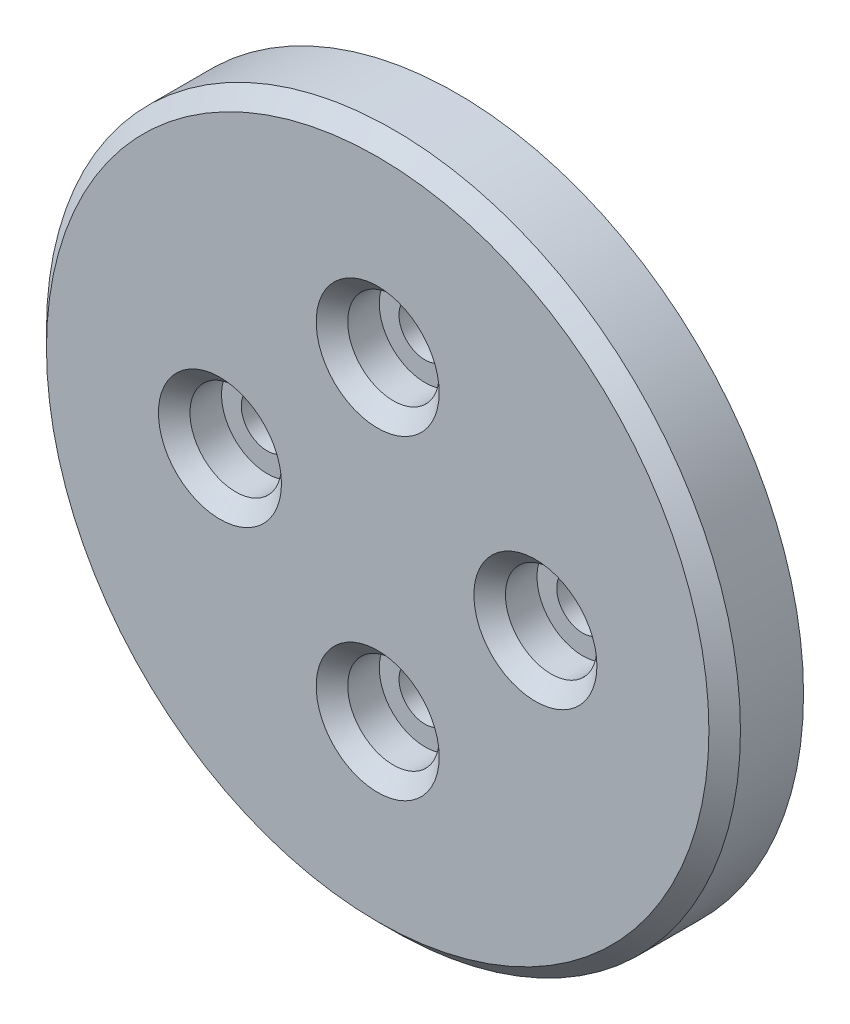
ISO-10303-21;
HEADER;
FILE_DESCRIPTION(('STEP AP214'),'2;1');
FILE_NAME('part.step','',(''),(''),'','','');
FILE_SCHEMA(('AUTOMOTIVE_DESIGN { 1 0 10303 214 1 1 1 1 }'));
ENDSEC;
DATA;
#1=APPLICATION_CONTEXT('core data for automotive mechanical design processes');
#2=APPLICATION_PROTOCOL_DEFINITION('international standard','automotive_design',2000,#1);
#3=PRODUCT_CONTEXT('',#1,'mechanical');
#4=PRODUCT('Part','Part','',(#3));
#5=PRODUCT_RELATED_PRODUCT_CATEGORY('part','',(#4));
#6=PRODUCT_DEFINITION_FORMATION('','',#4);
#7=PRODUCT_DEFINITION_CONTEXT('part definition',#1,'design');
#8=PRODUCT_DEFINITION('design','',#6,#7);
#9=PRODUCT_DEFINITION_SHAPE('','',#8);
#10=(LENGTH_UNIT() NAMED_UNIT(*) SI_UNIT(.MILLI.,.METRE.));
#11=(NAMED_UNIT(*) PLANE_ANGLE_UNIT() SI_UNIT($,.RADIAN.));
#12=(NAMED_UNIT(*) SI_UNIT($,.STERADIAN.) SOLID_ANGLE_UNIT());
#13=UNCERTAINTY_MEASURE_WITH_UNIT(LENGTH_MEASURE(1.E-05),#10,'distance_accuracy_value','');
#14=(GEOMETRIC_REPRESENTATION_CONTEXT(3) GLOBAL_UNCERTAINTY_ASSIGNED_CONTEXT((#13)) GLOBAL_UNIT_ASSIGNED_CONTEXT((#10,
#11,#12)) REPRESENTATION_CONTEXT('',''));
#15=CARTESIAN_POINT('',(0.,0.,0.));
#16=DIRECTION('',(0.,0.,1.));
#17=DIRECTION('',(1.,0.,0.));
#18=AXIS2_PLACEMENT_3D('',#15,#16,#17);
#19=CARTESIAN_POINT('',(10.,0.,5.));
#20=DIRECTION('',(0.,0.,-1.));
#21=DIRECTION('',(-1.,0.,0.));
#22=AXIS2_PLACEMENT_3D('',#19,#20,#21);
#23=CYLINDRICAL_SURFACE('',#22,1.65);
#24=CARTESIAN_POINT('',(10.,0.,0.));
#25=DIRECTION('',(0.,0.,1.));
#26=DIRECTION('',(1.,0.,0.));
#27=AXIS2_PLACEMENT_3D('',#24,#25,#26);
#28=CIRCLE('',#27,1.65);
#29=CARTESIAN_POINT('',(11.65,0.,0.));
#30=VERTEX_POINT('',#29);
#31=EDGE_CURVE('E101',#30,#30,#28,.T.);
#32=ORIENTED_EDGE('',*,*,#31,.F.);
#33=EDGE_LOOP('',(#32));
#34=FACE_BOUND('',#33,.T.);
#35=CARTESIAN_POINT('',(10.,0.,2.));
#36=DIRECTION('',(0.,0.,1.));
#37=DIRECTION('',(1.,0.,0.));
#38=AXIS2_PLACEMENT_3D('',#35,#36,#37);
#39=CIRCLE('',#38,1.65);
#40=CARTESIAN_POINT('',(11.65,0.,2.));
#41=VERTEX_POINT('',#40);
#42=EDGE_CURVE('E85',#41,#41,#39,.T.);
#43=ORIENTED_EDGE('',*,*,#42,.T.);
#44=EDGE_LOOP('',(#43));
#45=FACE_BOUND('',#44,.T.);
#46=ADVANCED_FACE('F45',(#34,#45),#23,.F.);
#47=CARTESIAN_POINT('',(0.,-10.,5.));
#48=DIRECTION('',(0.,0.,-1.));
#49=DIRECTION('',(-1.,0.,0.));
#50=AXIS2_PLACEMENT_3D('',#47,#48,#49);
#51=CYLINDRICAL_SURFACE('',#50,1.65);
#52=CARTESIAN_POINT('',(0.,-10.,0.));
#53=DIRECTION('',(0.,0.,1.));
#54=DIRECTION('',(1.,0.,0.));
#55=AXIS2_PLACEMENT_3D('',#52,#53,#54);
#56=CIRCLE('',#55,1.65);
#57=CARTESIAN_POINT('',(1.65,-10.,0.));
#58=VERTEX_POINT('',#57);
#59=EDGE_CURVE('E104',#58,#58,#56,.T.);
#60=ORIENTED_EDGE('',*,*,#59,.F.);
#61=EDGE_LOOP('',(#60));
#62=FACE_BOUND('',#61,.T.);
#63=CARTESIAN_POINT('',(0.,-10.,2.));
#64=DIRECTION('',(0.,0.,1.));
#65=DIRECTION('',(1.,0.,0.));
#66=AXIS2_PLACEMENT_3D('',#63,#64,#65);
#67=CIRCLE('',#66,1.65);
#68=CARTESIAN_POINT('',(1.65,-10.,2.));
#69=VERTEX_POINT('',#68);
#70=EDGE_CURVE('E89',#69,#69,#67,.T.);
#71=ORIENTED_EDGE('',*,*,#70,.T.);
#72=EDGE_LOOP('',(#71));
#73=FACE_BOUND('',#72,.T.);
#74=ADVANCED_FACE('F144',(#62,#73),#51,.F.);
#75=CARTESIAN_POINT('',(-10.,0.,5.));
#76=DIRECTION('',(0.,0.,-1.));
#77=DIRECTION('',(-1.,0.,0.));
#78=AXIS2_PLACEMENT_3D('',#75,#76,#77);
#79=CYLINDRICAL_SURFACE('',#78,1.65);
#80=CARTESIAN_POINT('',(-10.,0.,0.));
#81=DIRECTION('',(0.,0.,1.));
#82=DIRECTION('',(1.,0.,0.));
#83=AXIS2_PLACEMENT_3D('',#80,#81,#82);
#84=CIRCLE('',#83,1.65);
#85=CARTESIAN_POINT('',(-8.35,0.,0.));
#86=VERTEX_POINT('',#85);
#87=EDGE_CURVE('E107',#86,#86,#84,.T.);
#88=ORIENTED_EDGE('',*,*,#87,.F.);
#89=EDGE_LOOP('',(#88));
#90=FACE_BOUND('',#89,.T.);
#91=CARTESIAN_POINT('',(-10.,0.,2.));
#92=DIRECTION('',(0.,0.,1.));
#93=DIRECTION('',(1.,0.,0.));
#94=AXIS2_PLACEMENT_3D('',#91,#92,#93);
#95=CIRCLE('',#94,1.65);
#96=CARTESIAN_POINT('',(-8.35,0.,2.));
#97=VERTEX_POINT('',#96);
#98=EDGE_CURVE('E92',#97,#97,#95,.T.);
#99=ORIENTED_EDGE('',*,*,#98,.T.);
#100=EDGE_LOOP('',(#99));
#101=FACE_BOUND('',#100,.T.);
#102=ADVANCED_FACE('F151',(#90,#101),#79,.F.);
#103=CARTESIAN_POINT('',(0.,10.,5.));
#104=DIRECTION('',(0.,0.,-1.));
#105=DIRECTION('',(-1.,0.,0.));
#106=AXIS2_PLACEMENT_3D('',#103,#104,#105);
#107=CYLINDRICAL_SURFACE('',#106,1.65);
#108=CARTESIAN_POINT('',(0.,10.,0.));
#109=DIRECTION('',(0.,0.,1.));
#110=DIRECTION('',(1.,0.,0.));
#111=AXIS2_PLACEMENT_3D('',#108,#109,#110);
#112=CIRCLE('',#111,1.65);
#113=CARTESIAN_POINT('',(1.65,10.,0.));
#114=VERTEX_POINT('',#113);
#115=EDGE_CURVE('E88',#114,#114,#112,.T.);
#116=ORIENTED_EDGE('',*,*,#115,.F.);
#117=EDGE_LOOP('',(#116));
#118=FACE_BOUND('',#117,.T.);
#119=CARTESIAN_POINT('',(0.,10.,2.));
#120=DIRECTION('',(0.,0.,1.));
#121=DIRECTION('',(1.,0.,0.));
#122=AXIS2_PLACEMENT_3D('',#119,#120,#121);
#123=CIRCLE('',#122,1.65);
#124=CARTESIAN_POINT('',(1.65,10.,2.));
#125=VERTEX_POINT('',#124);
#126=EDGE_CURVE('E95',#125,#125,#123,.T.);
#127=ORIENTED_EDGE('',*,*,#126,.T.);
#128=EDGE_LOOP('',(#127));
#129=FACE_BOUND('',#128,.T.);
#130=ADVANCED_FACE('F162',(#118,#129),#107,.F.);
#131=CARTESIAN_POINT('',(0.,0.,5.));
#132=DIRECTION('',(0.,0.,-1.));
#133=DIRECTION('',(-1.,0.,0.));
#134=AXIS2_PLACEMENT_3D('',#131,#132,#133);
#135=CYLINDRICAL_SURFACE('',#134,22.);
#136=CARTESIAN_POINT('',(0.,0.,4.));
#137=DIRECTION('',(0.,0.,1.));
#138=DIRECTION('',(1.,0.,0.));
#139=AXIS2_PLACEMENT_3D('',#136,#137,#138);
#140=CIRCLE('',#139,22.);
#141=CARTESIAN_POINT('',(22.,0.,4.));
#142=VERTEX_POINT('',#141);
#143=EDGE_CURVE('E66',#142,#142,#140,.F.);
#144=ORIENTED_EDGE('',*,*,#143,.T.);
#145=EDGE_LOOP('',(#144));
#146=FACE_BOUND('',#145,.T.);
#147=CARTESIAN_POINT('',(0.,0.,0.));
#148=DIRECTION('',(0.,0.,1.));
#149=DIRECTION('',(1.,0.,0.));
#150=AXIS2_PLACEMENT_3D('',#147,#148,#149);
#151=CIRCLE('',#150,22.);
#152=CARTESIAN_POINT('',(22.,0.,0.));
#153=VERTEX_POINT('',#152);
#154=EDGE_CURVE('E84',#153,#153,#151,.T.);
#155=ORIENTED_EDGE('',*,*,#154,.T.);
#156=EDGE_LOOP('',(#155));
#157=FACE_BOUND('',#156,.T.);
#158=ADVANCED_FACE('F157',(#146,#157),#135,.T.);
#159=CARTESIAN_POINT('',(0.,0.,5.));
#160=DIRECTION('',(0.,0.,1.));
#161=DIRECTION('',(1.,0.,0.));
#162=AXIS2_PLACEMENT_3D('',#159,#160,#161);
#163=PLANE('',#162);
#164=CARTESIAN_POINT('',(0.,0.,5.));
#165=DIRECTION('',(0.,0.,1.));
#166=DIRECTION('',(1.,0.,0.));
#167=AXIS2_PLACEMENT_3D('',#164,#165,#166);
#168=CIRCLE('',#167,21.);
#169=CARTESIAN_POINT('',(21.,0.,5.));
#170=VERTEX_POINT('',#169);
#171=EDGE_CURVE('E69',#170,#170,#168,.T.);
#172=ORIENTED_EDGE('',*,*,#171,.T.);
#173=EDGE_LOOP('',(#172));
#174=FACE_BOUND('',#173,.T.);
#175=CARTESIAN_POINT('',(-10.,0.,5.));
#176=DIRECTION('',(0.,0.,1.));
#177=DIRECTION('',(1.,0.,0.));
#178=AXIS2_PLACEMENT_3D('',#175,#176,#177);
#179=CIRCLE('',#178,3.9);
#180=CARTESIAN_POINT('',(-6.1,0.,5.));
#181=VERTEX_POINT('',#180);
#182=EDGE_CURVE('E72',#181,#181,#179,.F.);
#183=ORIENTED_EDGE('',*,*,#182,.T.);
#184=EDGE_LOOP('',(#183));
#185=FACE_BOUND('',#184,.T.);
#186=CARTESIAN_POINT('',(0.,-10.,5.));
#187=DIRECTION('',(0.,0.,1.));
#188=DIRECTION('',(1.,0.,0.));
#189=AXIS2_PLACEMENT_3D('',#186,#187,#188);
#190=CIRCLE('',#189,3.9);
#191=CARTESIAN_POINT('',(3.9,-10.,5.));
#192=VERTEX_POINT('',#191);
#193=EDGE_CURVE('E75',#192,#192,#190,.F.);
#194=ORIENTED_EDGE('',*,*,#193,.T.);
#195=EDGE_LOOP('',(#194));
#196=FACE_BOUND('',#195,.T.);
#197=CARTESIAN_POINT('',(10.,0.,5.));
#198=DIRECTION('',(0.,0.,1.));
#199=DIRECTION('',(1.,0.,0.));
#200=AXIS2_PLACEMENT_3D('',#197,#198,#199);
#201=CIRCLE('',#200,3.9);
#202=CARTESIAN_POINT('',(13.9,0.,5.));
#203=VERTEX_POINT('',#202);
#204=EDGE_CURVE('E78',#203,#203,#201,.F.);
#205=ORIENTED_EDGE('',*,*,#204,.T.);
#206=EDGE_LOOP('',(#205));
#207=FACE_BOUND('',#206,.T.);
#208=CARTESIAN_POINT('',(0.,10.,5.));
#209=DIRECTION('',(0.,0.,1.));
#210=DIRECTION('',(1.,0.,0.));
#211=AXIS2_PLACEMENT_3D('',#208,#209,#210);
#212=CIRCLE('',#211,3.9);
#213=CARTESIAN_POINT('',(3.9,10.,5.));
#214=VERTEX_POINT('',#213);
#215=EDGE_CURVE('E81',#214,#214,#212,.F.);
#216=ORIENTED_EDGE('',*,*,#215,.T.);
#217=EDGE_LOOP('',(#216));
#218=FACE_BOUND('',#217,.T.);
#219=ADVANCED_FACE('F198',(#174,#185,#196,#207,#218),#163,.T.);
#220=CARTESIAN_POINT('',(0.,0.,0.));
#221=DIRECTION('',(0.,0.,1.));
#222=DIRECTION('',(1.,0.,0.));
#223=AXIS2_PLACEMENT_3D('',#220,#221,#222);
#224=PLANE('',#223);
#225=ORIENTED_EDGE('',*,*,#115,.T.);
#226=EDGE_LOOP('',(#225));
#227=FACE_BOUND('',#226,.T.);
#228=ORIENTED_EDGE('',*,*,#87,.T.);
#229=EDGE_LOOP('',(#228));
#230=FACE_BOUND('',#229,.T.);
#231=ORIENTED_EDGE('',*,*,#59,.T.);
#232=EDGE_LOOP('',(#231));
#233=FACE_BOUND('',#232,.T.);
#234=ORIENTED_EDGE('',*,*,#31,.T.);
#235=EDGE_LOOP('',(#234));
#236=FACE_BOUND('',#235,.T.);
#237=ORIENTED_EDGE('',*,*,#154,.F.);
#238=EDGE_LOOP('',(#237));
#239=FACE_BOUND('',#238,.T.);
#240=ADVANCED_FACE('F201',(#227,#230,#233,#236,#239),#224,.F.);
#241=CARTESIAN_POINT('',(-10.,0.,2.));
#242=DIRECTION('',(0.,0.,1.));
#243=DIRECTION('',(1.,0.,0.));
#244=AXIS2_PLACEMENT_3D('',#241,#242,#243);
#245=CYLINDRICAL_SURFACE('',#244,2.9);
#246=CARTESIAN_POINT('',(-10.,0.,4.));
#247=DIRECTION('',(0.,0.,1.));
#248=DIRECTION('',(1.,0.,0.));
#249=AXIS2_PLACEMENT_3D('',#246,#247,#248);
#250=CIRCLE('',#249,2.9);
#251=CARTESIAN_POINT('',(-7.1,0.,4.));
#252=VERTEX_POINT('',#251);
#253=EDGE_CURVE('E61',#252,#252,#250,.T.);
#254=ORIENTED_EDGE('',*,*,#253,.T.);
#255=EDGE_LOOP('',(#254));
#256=FACE_BOUND('',#255,.T.);
#257=CARTESIAN_POINT('',(-10.,0.,2.));
#258=DIRECTION('',(0.,0.,1.));
#259=DIRECTION('',(1.,0.,0.));
#260=AXIS2_PLACEMENT_3D('',#257,#258,#259);
#261=CIRCLE('',#260,2.9);
#262=CARTESIAN_POINT('',(-7.1,0.,2.));
#263=VERTEX_POINT('',#262);
#264=EDGE_CURVE('E112',#263,#263,#261,.T.);
#265=ORIENTED_EDGE('',*,*,#264,.F.);
#266=EDGE_LOOP('',(#265));
#267=FACE_BOUND('',#266,.T.);
#268=ADVANCED_FACE('F210',(#256,#267),#245,.F.);
#269=CARTESIAN_POINT('',(-10.,0.,2.));
#270=DIRECTION('',(0.,0.,1.));
#271=DIRECTION('',(1.,0.,0.));
#272=AXIS2_PLACEMENT_3D('',#269,#270,#271);
#273=PLANE('',#272);
#274=ORIENTED_EDGE('',*,*,#98,.F.);
#275=EDGE_LOOP('',(#274));
#276=FACE_BOUND('',#275,.T.);
#277=ORIENTED_EDGE('',*,*,#264,.T.);
#278=EDGE_LOOP('',(#277));
#279=FACE_BOUND('',#278,.T.);
#280=ADVANCED_FACE('F215',(#276,#279),#273,.T.);
#281=CARTESIAN_POINT('',(0.,-10.,2.));
#282=DIRECTION('',(0.,0.,1.));
#283=DIRECTION('',(1.,0.,0.));
#284=AXIS2_PLACEMENT_3D('',#281,#282,#283);
#285=CYLINDRICAL_SURFACE('',#284,2.9);
#286=CARTESIAN_POINT('',(0.,-10.,4.));
#287=DIRECTION('',(0.,0.,1.));
#288=DIRECTION('',(1.,0.,0.));
#289=AXIS2_PLACEMENT_3D('',#286,#287,#288);
#290=CIRCLE('',#289,2.9);
#291=CARTESIAN_POINT('',(2.9,-10.,4.));
#292=VERTEX_POINT('',#291);
#293=EDGE_CURVE('E57',#292,#292,#290,.T.);
#294=ORIENTED_EDGE('',*,*,#293,.T.);
#295=EDGE_LOOP('',(#294));
#296=FACE_BOUND('',#295,.T.);
#297=CARTESIAN_POINT('',(0.,-10.,2.));
#298=DIRECTION('',(0.,0.,1.));
#299=DIRECTION('',(1.,0.,0.));
#300=AXIS2_PLACEMENT_3D('',#297,#298,#299);
#301=CIRCLE('',#300,2.9);
#302=CARTESIAN_POINT('',(2.9,-10.,2.));
#303=VERTEX_POINT('',#302);
#304=EDGE_CURVE('E115',#303,#303,#301,.T.);
#305=ORIENTED_EDGE('',*,*,#304,.F.);
#306=EDGE_LOOP('',(#305));
#307=FACE_BOUND('',#306,.T.);
#308=ADVANCED_FACE('F218',(#296,#307),#285,.F.);
#309=CARTESIAN_POINT('',(0.,-10.,2.));
#310=DIRECTION('',(0.,0.,1.));
#311=DIRECTION('',(1.,0.,0.));
#312=AXIS2_PLACEMENT_3D('',#309,#310,#311);
#313=PLANE('',#312);
#314=ORIENTED_EDGE('',*,*,#70,.F.);
#315=EDGE_LOOP('',(#314));
#316=FACE_BOUND('',#315,.T.);
#317=ORIENTED_EDGE('',*,*,#304,.T.);
#318=EDGE_LOOP('',(#317));
#319=FACE_BOUND('',#318,.T.);
#320=ADVANCED_FACE('F222',(#316,#319),#313,.T.);
#321=CARTESIAN_POINT('',(10.,0.,2.));
#322=DIRECTION('',(0.,0.,1.));
#323=DIRECTION('',(1.,0.,0.));
#324=AXIS2_PLACEMENT_3D('',#321,#322,#323);
#325=CYLINDRICAL_SURFACE('',#324,2.9);
#326=CARTESIAN_POINT('',(10.,0.,4.));
#327=DIRECTION('',(0.,0.,1.));
#328=DIRECTION('',(1.,0.,0.));
#329=AXIS2_PLACEMENT_3D('',#326,#327,#328);
#330=CIRCLE('',#329,2.9);
#331=CARTESIAN_POINT('',(12.9,0.,4.));
#332=VERTEX_POINT('',#331);
#333=EDGE_CURVE('E53',#332,#332,#330,.T.);
#334=ORIENTED_EDGE('',*,*,#333,.T.);
#335=EDGE_LOOP('',(#334));
#336=FACE_BOUND('',#335,.T.);
#337=CARTESIAN_POINT('',(10.,0.,2.));
#338=DIRECTION('',(0.,0.,1.));
#339=DIRECTION('',(1.,0.,0.));
#340=AXIS2_PLACEMENT_3D('',#337,#338,#339);
#341=CIRCLE('',#340,2.9);
#342=CARTESIAN_POINT('',(12.9,0.,2.));
#343=VERTEX_POINT('',#342);
#344=EDGE_CURVE('E118',#343,#343,#341,.T.);
#345=ORIENTED_EDGE('',*,*,#344,.F.);
#346=EDGE_LOOP('',(#345));
#347=FACE_BOUND('',#346,.T.);
#348=ADVANCED_FACE('F139',(#336,#347),#325,.F.);
#349=CARTESIAN_POINT('',(10.,0.,2.));
#350=DIRECTION('',(0.,0.,1.));
#351=DIRECTION('',(1.,0.,0.));
#352=AXIS2_PLACEMENT_3D('',#349,#350,#351);
#353=PLANE('',#352);
#354=ORIENTED_EDGE('',*,*,#42,.F.);
#355=EDGE_LOOP('',(#354));
#356=FACE_BOUND('',#355,.T.);
#357=ORIENTED_EDGE('',*,*,#344,.T.);
#358=EDGE_LOOP('',(#357));
#359=FACE_BOUND('',#358,.T.);
#360=ADVANCED_FACE('F128',(#356,#359),#353,.T.);
#361=CARTESIAN_POINT('',(0.,10.,2.));
#362=DIRECTION('',(0.,0.,1.));
#363=DIRECTION('',(1.,0.,0.));
#364=AXIS2_PLACEMENT_3D('',#361,#362,#363);
#365=CYLINDRICAL_SURFACE('',#364,2.9);
#366=CARTESIAN_POINT('',(0.,10.,4.));
#367=DIRECTION('',(0.,0.,1.));
#368=DIRECTION('',(1.,0.,0.));
#369=AXIS2_PLACEMENT_3D('',#366,#367,#368);
#370=CIRCLE('',#369,2.9);
#371=CARTESIAN_POINT('',(2.9,10.,4.));
#372=VERTEX_POINT('',#371);
#373=EDGE_CURVE('E12',#372,#372,#370,.T.);
#374=ORIENTED_EDGE('',*,*,#373,.T.);
#375=EDGE_LOOP('',(#374));
#376=FACE_BOUND('',#375,.T.);
#377=CARTESIAN_POINT('',(0.,10.,2.));
#378=DIRECTION('',(0.,0.,1.));
#379=DIRECTION('',(1.,0.,0.));
#380=AXIS2_PLACEMENT_3D('',#377,#378,#379);
#381=CIRCLE('',#380,2.9);
#382=CARTESIAN_POINT('',(2.9,10.,2.));
#383=VERTEX_POINT('',#382);
#384=EDGE_CURVE('E98',#383,#383,#381,.T.);
#385=ORIENTED_EDGE('',*,*,#384,.F.);
#386=EDGE_LOOP('',(#385));
#387=FACE_BOUND('',#386,.T.);
#388=ADVANCED_FACE('F126',(#376,#387),#365,.F.);
#389=CARTESIAN_POINT('',(0.,10.,2.));
#390=DIRECTION('',(0.,0.,1.));
#391=DIRECTION('',(1.,0.,0.));
#392=AXIS2_PLACEMENT_3D('',#389,#390,#391);
#393=PLANE('',#392);
#394=ORIENTED_EDGE('',*,*,#126,.F.);
#395=EDGE_LOOP('',(#394));
#396=FACE_BOUND('',#395,.T.);
#397=ORIENTED_EDGE('',*,*,#384,.T.);
#398=EDGE_LOOP('',(#397));
#399=FACE_BOUND('',#398,.T.);
#400=ADVANCED_FACE('F124',(#396,#399),#393,.T.);
#401=CARTESIAN_POINT('',(0.,0.,5.));
#402=DIRECTION('',(0.,0.,-1.));
#403=DIRECTION('',(-1.,0.,0.));
#404=AXIS2_PLACEMENT_3D('',#401,#402,#403);
#405=CONICAL_SURFACE('',#404,21.,0.785398163397449);
#406=ORIENTED_EDGE('',*,*,#143,.F.);
#407=EDGE_LOOP('',(#406));
#408=FACE_BOUND('',#407,.T.);
#409=ORIENTED_EDGE('',*,*,#171,.F.);
#410=EDGE_LOOP('',(#409));
#411=FACE_BOUND('',#410,.T.);
#412=ADVANCED_FACE('F135',(#408,#411),#405,.T.);
#413=CARTESIAN_POINT('',(-10.,0.,4.));
#414=DIRECTION('',(0.,0.,1.));
#415=DIRECTION('',(1.,0.,0.));
#416=AXIS2_PLACEMENT_3D('',#413,#414,#415);
#417=CONICAL_SURFACE('',#416,2.9,0.785398163397448);
#418=ORIENTED_EDGE('',*,*,#182,.F.);
#419=EDGE_LOOP('',(#418));
#420=FACE_BOUND('',#419,.T.);
#421=ORIENTED_EDGE('',*,*,#253,.F.);
#422=EDGE_LOOP('',(#421));
#423=FACE_BOUND('',#422,.T.);
#424=ADVANCED_FACE('F172',(#420,#423),#417,.F.);
#425=CARTESIAN_POINT('',(0.,-10.,4.));
#426=DIRECTION('',(0.,0.,1.));
#427=DIRECTION('',(1.,0.,0.));
#428=AXIS2_PLACEMENT_3D('',#425,#426,#427);
#429=CONICAL_SURFACE('',#428,2.9,0.785398163397448);
#430=ORIENTED_EDGE('',*,*,#193,.F.);
#431=EDGE_LOOP('',(#430));
#432=FACE_BOUND('',#431,.T.);
#433=ORIENTED_EDGE('',*,*,#293,.F.);
#434=EDGE_LOOP('',(#433));
#435=FACE_BOUND('',#434,.T.);
#436=ADVANCED_FACE('F179',(#432,#435),#429,.F.);
#437=CARTESIAN_POINT('',(10.,0.,4.));
#438=DIRECTION('',(0.,0.,1.));
#439=DIRECTION('',(1.,0.,0.));
#440=AXIS2_PLACEMENT_3D('',#437,#438,#439);
#441=CONICAL_SURFACE('',#440,2.9,0.785398163397448);
#442=ORIENTED_EDGE('',*,*,#204,.F.);
#443=EDGE_LOOP('',(#442));
#444=FACE_BOUND('',#443,.T.);
#445=ORIENTED_EDGE('',*,*,#333,.F.);
#446=EDGE_LOOP('',(#445));
#447=FACE_BOUND('',#446,.T.);
#448=ADVANCED_FACE('F185',(#444,#447),#441,.F.);
#449=CARTESIAN_POINT('',(0.,10.,4.));
#450=DIRECTION('',(0.,0.,1.));
#451=DIRECTION('',(1.,0.,0.));
#452=AXIS2_PLACEMENT_3D('',#449,#450,#451);
#453=CONICAL_SURFACE('',#452,2.9,0.785398163397448);
#454=ORIENTED_EDGE('',*,*,#215,.F.);
#455=EDGE_LOOP('',(#454));
#456=FACE_BOUND('',#455,.T.);
#457=ORIENTED_EDGE('',*,*,#373,.F.);
#458=EDGE_LOOP('',(#457));
#459=FACE_BOUND('',#458,.T.);
#460=ADVANCED_FACE('F48',(#456,#459),#453,.F.);
#461=CLOSED_SHELL('',(#46,#74,#102,#130,#158,#219,#240,#268,#280,#308,#320,#348,#360,#388,#400,
#412,#424,#436,#448,#460));
#462=MANIFOLD_SOLID_BREP('B2',#461);
#463=ADVANCED_BREP_SHAPE_REPRESENTATION('',(#18,#462),#14);
#464=SHAPE_DEFINITION_REPRESENTATION(#9,#463);
ENDSEC;
END-ISO-10303-21;
